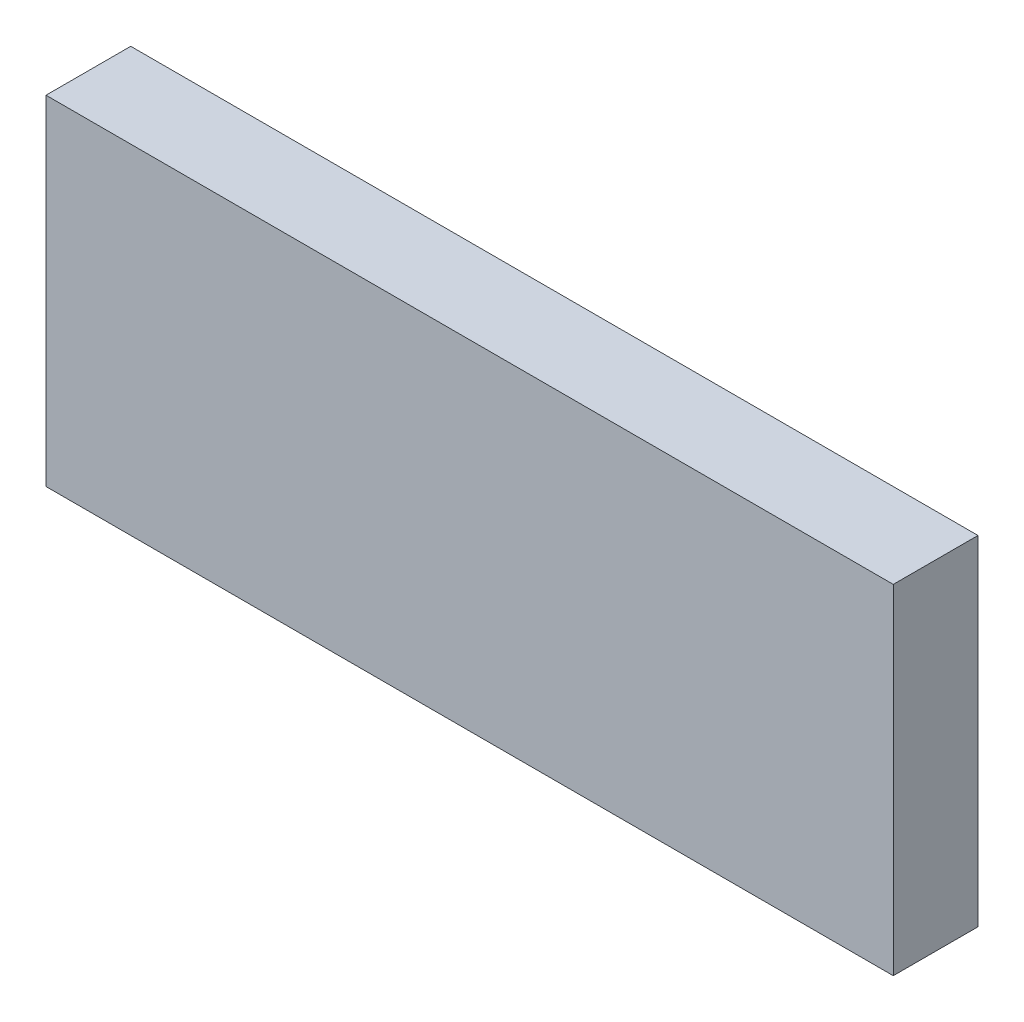
ISO-10303-21;
HEADER;
FILE_DESCRIPTION(('STEP AP214'),'2;1');
FILE_NAME('part.step','',(''),(''),'','','');
FILE_SCHEMA(('AUTOMOTIVE_DESIGN { 1 0 10303 214 1 1 1 1 }'));
ENDSEC;
DATA;
#1=APPLICATION_CONTEXT('core data for automotive mechanical design processes');
#2=APPLICATION_PROTOCOL_DEFINITION('international standard','automotive_design',2000,#1);
#3=PRODUCT_CONTEXT('',#1,'mechanical');
#4=PRODUCT('Part','Part','',(#3));
#5=PRODUCT_RELATED_PRODUCT_CATEGORY('part','',(#4));
#6=PRODUCT_DEFINITION_FORMATION('','',#4);
#7=PRODUCT_DEFINITION_CONTEXT('part definition',#1,'design');
#8=PRODUCT_DEFINITION('design','',#6,#7);
#9=PRODUCT_DEFINITION_SHAPE('','',#8);
#10=(LENGTH_UNIT() NAMED_UNIT(*) SI_UNIT(.MILLI.,.METRE.));
#11=(NAMED_UNIT(*) PLANE_ANGLE_UNIT() SI_UNIT($,.RADIAN.));
#12=(NAMED_UNIT(*) SI_UNIT($,.STERADIAN.) SOLID_ANGLE_UNIT());
#13=UNCERTAINTY_MEASURE_WITH_UNIT(LENGTH_MEASURE(1.E-05),#10,'distance_accuracy_value','');
#14=(GEOMETRIC_REPRESENTATION_CONTEXT(3) GLOBAL_UNCERTAINTY_ASSIGNED_CONTEXT((#13)) GLOBAL_UNIT_ASSIGNED_CONTEXT((#10,
#11,#12)) REPRESENTATION_CONTEXT('',''));
#15=CARTESIAN_POINT('',(0.,0.,0.));
#16=DIRECTION('',(0.,0.,1.));
#17=DIRECTION('',(1.,0.,0.));
#18=AXIS2_PLACEMENT_3D('',#15,#16,#17);
#19=CARTESIAN_POINT('',(141.,-36.4613160518445,10.));
#20=DIRECTION('',(-1.,0.,0.));
#21=DIRECTION('',(0.,0.,1.));
#22=AXIS2_PLACEMENT_3D('',#19,#20,#21);
#23=PLANE('',#22);
#24=DIRECTION('',(0.,1.,0.));
#25=VECTOR('',#24,1.);
#26=CARTESIAN_POINT('',(141.,-36.4613160518445,0.));
#27=LINE('',#26,#25);
#28=CARTESIAN_POINT('',(141.,-36.4613160518445,0.));
#29=VERTEX_POINT('',#28);
#30=CARTESIAN_POINT('',(141.,3.53868394815551,0.));
#31=VERTEX_POINT('',#30);
#32=EDGE_CURVE('E74',#29,#31,#27,.T.);
#33=ORIENTED_EDGE('',*,*,#32,.T.);
#34=DIRECTION('',(0.,0.,-1.));
#35=VECTOR('',#34,1.);
#36=CARTESIAN_POINT('',(141.,3.53868394815551,10.));
#37=LINE('',#36,#35);
#38=CARTESIAN_POINT('',(141.,3.53868394815551,10.));
#39=VERTEX_POINT('',#38);
#40=EDGE_CURVE('E11',#39,#31,#37,.T.);
#41=ORIENTED_EDGE('',*,*,#40,.F.);
#42=DIRECTION('',(0.,1.,0.));
#43=VECTOR('',#42,1.);
#44=CARTESIAN_POINT('',(141.,-36.4613160518445,10.));
#45=LINE('',#44,#43);
#46=CARTESIAN_POINT('',(141.,-36.4613160518445,10.));
#47=VERTEX_POINT('',#46);
#48=EDGE_CURVE('E92',#47,#39,#45,.T.);
#49=ORIENTED_EDGE('',*,*,#48,.F.);
#50=DIRECTION('',(0.,0.,-1.));
#51=VECTOR('',#50,1.);
#52=CARTESIAN_POINT('',(141.,-36.4613160518445,10.));
#53=LINE('',#52,#51);
#54=EDGE_CURVE('E86',#47,#29,#53,.T.);
#55=ORIENTED_EDGE('',*,*,#54,.T.);
#56=EDGE_LOOP('',(#33,#41,#49,#55));
#57=FACE_BOUND('',#56,.T.);
#58=ADVANCED_FACE('F30',(#57),#23,.F.);
#59=CARTESIAN_POINT('',(141.,3.53868394815551,10.));
#60=DIRECTION('',(0.,-1.,0.));
#61=DIRECTION('',(1.,0.,0.));
#62=AXIS2_PLACEMENT_3D('',#59,#60,#61);
#63=PLANE('',#62);
#64=DIRECTION('',(-1.,0.,0.));
#65=VECTOR('',#64,1.);
#66=CARTESIAN_POINT('',(141.,3.53868394815551,0.));
#67=LINE('',#66,#65);
#68=CARTESIAN_POINT('',(41.,3.5386839481555,0.));
#69=VERTEX_POINT('',#68);
#70=EDGE_CURVE('E70',#31,#69,#67,.T.);
#71=ORIENTED_EDGE('',*,*,#70,.T.);
#72=DIRECTION('',(0.,0.,-1.));
#73=VECTOR('',#72,1.);
#74=CARTESIAN_POINT('',(41.,3.5386839481555,10.));
#75=LINE('',#74,#73);
#76=CARTESIAN_POINT('',(41.,3.5386839481555,10.));
#77=VERTEX_POINT('',#76);
#78=EDGE_CURVE('E37',#77,#69,#75,.T.);
#79=ORIENTED_EDGE('',*,*,#78,.F.);
#80=DIRECTION('',(-1.,0.,0.));
#81=VECTOR('',#80,1.);
#82=CARTESIAN_POINT('',(141.,3.53868394815551,10.));
#83=LINE('',#82,#81);
#84=EDGE_CURVE('E82',#39,#77,#83,.T.);
#85=ORIENTED_EDGE('',*,*,#84,.F.);
#86=ORIENTED_EDGE('',*,*,#40,.T.);
#87=EDGE_LOOP('',(#71,#79,#85,#86));
#88=FACE_BOUND('',#87,.T.);
#89=ADVANCED_FACE('F81',(#88),#63,.F.);
#90=CARTESIAN_POINT('',(41.,-36.4613160518445,10.));
#91=DIRECTION('',(1.,0.,0.));
#92=DIRECTION('',(0.,0.,-1.));
#93=AXIS2_PLACEMENT_3D('',#90,#91,#92);
#94=PLANE('',#93);
#95=DIRECTION('',(0.,-1.,0.));
#96=VECTOR('',#95,1.);
#97=CARTESIAN_POINT('',(41.,-36.4613160518445,0.));
#98=LINE('',#97,#96);
#99=CARTESIAN_POINT('',(41.,-36.4613160518445,0.));
#100=VERTEX_POINT('',#99);
#101=EDGE_CURVE('E75',#69,#100,#98,.T.);
#102=ORIENTED_EDGE('',*,*,#101,.T.);
#103=DIRECTION('',(0.,0.,-1.));
#104=VECTOR('',#103,1.);
#105=CARTESIAN_POINT('',(41.,-36.4613160518445,10.));
#106=LINE('',#105,#104);
#107=CARTESIAN_POINT('',(41.,-36.4613160518445,10.));
#108=VERTEX_POINT('',#107);
#109=EDGE_CURVE('E98',#108,#100,#106,.T.);
#110=ORIENTED_EDGE('',*,*,#109,.F.);
#111=DIRECTION('',(0.,-1.,0.));
#112=VECTOR('',#111,1.);
#113=CARTESIAN_POINT('',(41.,-36.4613160518445,10.));
#114=LINE('',#113,#112);
#115=EDGE_CURVE('E49',#77,#108,#114,.T.);
#116=ORIENTED_EDGE('',*,*,#115,.F.);
#117=ORIENTED_EDGE('',*,*,#78,.T.);
#118=EDGE_LOOP('',(#102,#110,#116,#117));
#119=FACE_BOUND('',#118,.T.);
#120=ADVANCED_FACE('F101',(#119),#94,.F.);
#121=CARTESIAN_POINT('',(141.,-36.4613160518445,10.));
#122=DIRECTION('',(0.,1.,0.));
#123=DIRECTION('',(-1.,0.,0.));
#124=AXIS2_PLACEMENT_3D('',#121,#122,#123);
#125=PLANE('',#124);
#126=DIRECTION('',(1.,0.,0.));
#127=VECTOR('',#126,1.);
#128=CARTESIAN_POINT('',(141.,-36.4613160518445,0.));
#129=LINE('',#128,#127);
#130=EDGE_CURVE('E90',#100,#29,#129,.T.);
#131=ORIENTED_EDGE('',*,*,#130,.T.);
#132=ORIENTED_EDGE('',*,*,#54,.F.);
#133=DIRECTION('',(1.,0.,0.));
#134=VECTOR('',#133,1.);
#135=CARTESIAN_POINT('',(141.,-36.4613160518445,10.));
#136=LINE('',#135,#134);
#137=EDGE_CURVE('E44',#108,#47,#136,.T.);
#138=ORIENTED_EDGE('',*,*,#137,.F.);
#139=ORIENTED_EDGE('',*,*,#109,.T.);
#140=EDGE_LOOP('',(#131,#132,#138,#139));
#141=FACE_BOUND('',#140,.T.);
#142=ADVANCED_FACE('F103',(#141),#125,.F.);
#143=CARTESIAN_POINT('',(141.,-36.4613160518445,10.));
#144=DIRECTION('',(0.,0.,1.));
#145=DIRECTION('',(1.,0.,0.));
#146=AXIS2_PLACEMENT_3D('',#143,#144,#145);
#147=PLANE('',#146);
#148=ORIENTED_EDGE('',*,*,#48,.T.);
#149=ORIENTED_EDGE('',*,*,#84,.T.);
#150=ORIENTED_EDGE('',*,*,#115,.T.);
#151=ORIENTED_EDGE('',*,*,#137,.T.);
#152=EDGE_LOOP('',(#148,#149,#150,#151));
#153=FACE_BOUND('',#152,.T.);
#154=ADVANCED_FACE('F104',(#153),#147,.T.);
#155=CARTESIAN_POINT('',(141.,-36.4613160518445,0.));
#156=DIRECTION('',(0.,0.,1.));
#157=DIRECTION('',(1.,0.,0.));
#158=AXIS2_PLACEMENT_3D('',#155,#156,#157);
#159=PLANE('',#158);
#160=ORIENTED_EDGE('',*,*,#32,.F.);
#161=ORIENTED_EDGE('',*,*,#130,.F.);
#162=ORIENTED_EDGE('',*,*,#101,.F.);
#163=ORIENTED_EDGE('',*,*,#70,.F.);
#164=EDGE_LOOP('',(#160,#161,#162,#163));
#165=FACE_BOUND('',#164,.T.);
#166=ADVANCED_FACE('F71',(#165),#159,.F.);
#167=CLOSED_SHELL('',(#58,#89,#120,#142,#154,#166));
#168=MANIFOLD_SOLID_BREP('B2',#167);
#169=ADVANCED_BREP_SHAPE_REPRESENTATION('',(#18,#168),#14);
#170=SHAPE_DEFINITION_REPRESENTATION(#9,#169);
ENDSEC;
END-ISO-10303-21;
